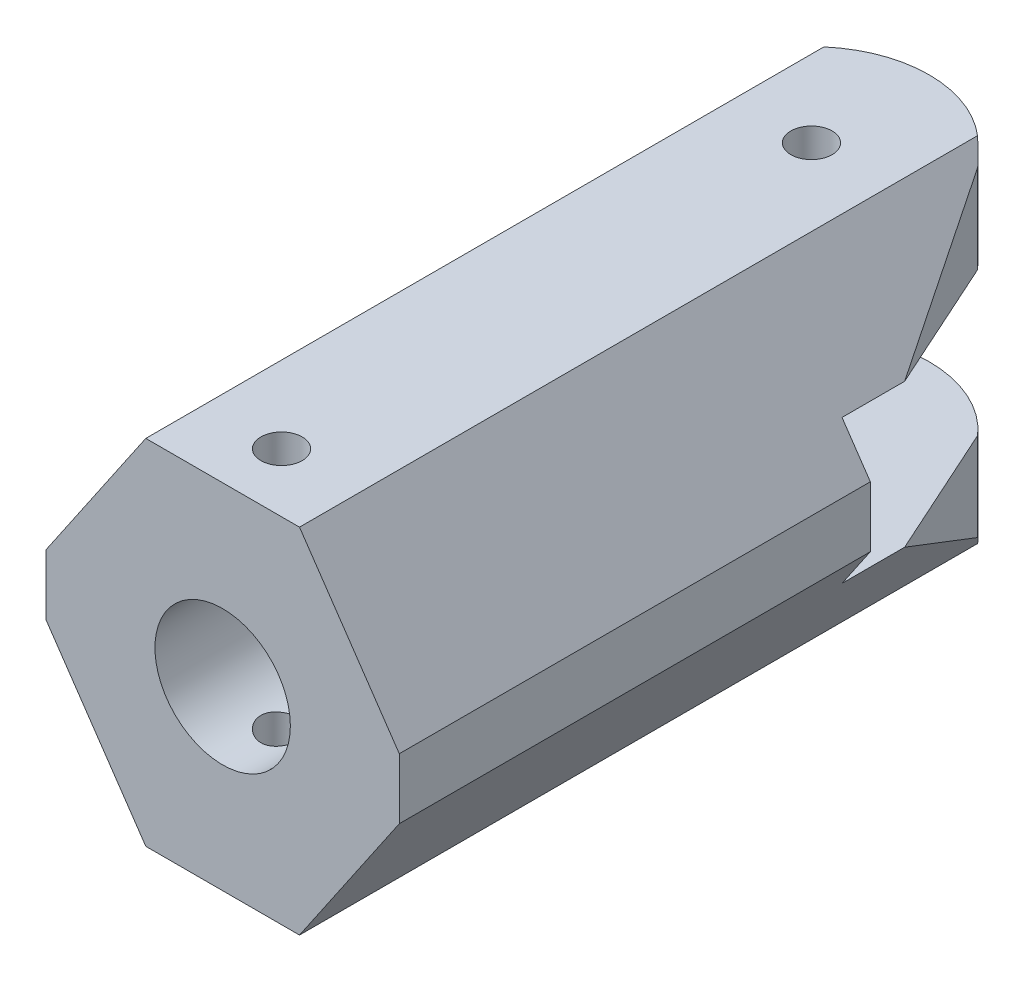
ISO-10303-21;
HEADER;
FILE_DESCRIPTION(('STEP AP214'),'2;1');
FILE_NAME('part.step','',(''),(''),'','','');
FILE_SCHEMA(('AUTOMOTIVE_DESIGN { 1 0 10303 214 1 1 1 1 }'));
ENDSEC;
DATA;
#1=APPLICATION_CONTEXT('core data for automotive mechanical design processes');
#2=APPLICATION_PROTOCOL_DEFINITION('international standard','automotive_design',2000,#1);
#3=PRODUCT_CONTEXT('',#1,'mechanical');
#4=PRODUCT('Part','Part','',(#3));
#5=PRODUCT_RELATED_PRODUCT_CATEGORY('part','',(#4));
#6=PRODUCT_DEFINITION_FORMATION('','',#4);
#7=PRODUCT_DEFINITION_CONTEXT('part definition',#1,'design');
#8=PRODUCT_DEFINITION('design','',#6,#7);
#9=PRODUCT_DEFINITION_SHAPE('','',#8);
#10=(LENGTH_UNIT() NAMED_UNIT(*) SI_UNIT(.MILLI.,.METRE.));
#11=(NAMED_UNIT(*) PLANE_ANGLE_UNIT() SI_UNIT($,.RADIAN.));
#12=(NAMED_UNIT(*) SI_UNIT($,.STERADIAN.) SOLID_ANGLE_UNIT());
#13=UNCERTAINTY_MEASURE_WITH_UNIT(LENGTH_MEASURE(1.E-05),#10,'distance_accuracy_value','');
#14=(GEOMETRIC_REPRESENTATION_CONTEXT(3) GLOBAL_UNCERTAINTY_ASSIGNED_CONTEXT((#13)) GLOBAL_UNIT_ASSIGNED_CONTEXT((#10,
#11,#12)) REPRESENTATION_CONTEXT('',''));
#15=CARTESIAN_POINT('',(0.,0.,0.));
#16=DIRECTION('',(0.,0.,1.));
#17=DIRECTION('',(1.,0.,0.));
#18=AXIS2_PLACEMENT_3D('',#15,#16,#17);
#19=CARTESIAN_POINT('',(24.9073490583335,30.,-11.2625234577486));
#20=DIRECTION('',(-0.911177791987446,0.,0.412013387390366));
#21=DIRECTION('',(0.412013387390366,0.,0.911177791987446));
#22=AXIS2_PLACEMENT_3D('',#19,#20,#21);
#23=PLANE('',#22);
#24=DIRECTION('',(0.412013387390366,0.,0.911177791987446));
#25=VECTOR('',#24,1.);
#26=CARTESIAN_POINT('',(24.9073490583335,21.1,-11.2625234577486));
#27=LINE('',#26,#25);
#28=CARTESIAN_POINT('',(22.4741765584102,21.1,-16.6435445940937));
#29=VERTEX_POINT('',#28);
#30=CARTESIAN_POINT('',(27.5950837724059,21.1,-5.31853169153904));
#31=VERTEX_POINT('',#30);
#32=EDGE_CURVE('E183',#29,#31,#27,.T.);
#33=ORIENTED_EDGE('',*,*,#32,.F.);
#34=DIRECTION('',(0.,-1.,0.));
#35=VECTOR('',#34,1.);
#36=CARTESIAN_POINT('',(22.4741765584102,30.,-16.6435445940937));
#37=LINE('',#36,#35);
#38=CARTESIAN_POINT('',(22.4741765584102,28.6102629224508,-16.6435445940937));
#39=VERTEX_POINT('',#38);
#40=EDGE_CURVE('E239',#39,#29,#37,.T.);
#41=ORIENTED_EDGE('',*,*,#40,.F.);
#42=DIRECTION('',(0.352635024078461,-0.517170422314209,0.779861073574342));
#43=VECTOR('',#42,1.);
#44=CARTESIAN_POINT('',(24.0031102855576,26.3679465120895,-13.2622698582866));
#45=LINE('',#44,#43);
#46=EDGE_CURVE('E211',#39,#31,#45,.T.);
#47=ORIENTED_EDGE('',*,*,#46,.T.);
#48=EDGE_LOOP('',(#33,#41,#47));
#49=FACE_BOUND('',#48,.T.);
#50=ADVANCED_FACE('F41',(#49),#23,.F.);
#51=CARTESIAN_POINT('',(15.,30.,-10.));
#52=DIRECTION('',(0.,-1.,0.));
#53=DIRECTION('',(0.,0.,-1.));
#54=AXIS2_PLACEMENT_3D('',#51,#52,#53);
#55=CYLINDRICAL_SURFACE('',#54,10.);
#56=CARTESIAN_POINT('',(15.,21.1,-10.));
#57=DIRECTION('',(0.,-1.,0.));
#58=DIRECTION('',(0.,0.,-1.));
#59=AXIS2_PLACEMENT_3D('',#56,#57,#58);
#60=CIRCLE('',#59,10.);
#61=CARTESIAN_POINT('',(5.76923076923077,21.1,-13.8461538461538));
#62=VERTEX_POINT('',#61);
#63=EDGE_CURVE('E187',#62,#29,#60,.T.);
#64=ORIENTED_EDGE('',*,*,#63,.F.);
#65=DIRECTION('',(0.,-1.,0.));
#66=VECTOR('',#65,1.);
#67=CARTESIAN_POINT('',(5.76923076923077,30.,-13.8461538461538));
#68=LINE('',#67,#66);
#69=CARTESIAN_POINT('',(5.76923076923077,26.0340645525582,-13.8461538461538));
#70=VERTEX_POINT('',#69);
#71=EDGE_CURVE('E235',#70,#62,#68,.T.);
#72=ORIENTED_EDGE('',*,*,#71,.F.);
#73=CARTESIAN_POINT('',(15.,39.5718032778521,-10.));
#74=DIRECTION('',(0.826213343184909,-0.563357356873252,0.));
#75=DIRECTION('',(-0.563357356873252,-0.826213343184909,0.));
#76=AXIS2_PLACEMENT_3D('',#73,#74,#75);
#77=ELLIPSE('',#76,17.7507223044038,10.);
#78=CARTESIAN_POINT('',(8.47342204092839,30.,-17.5765282381946));
#79=VERTEX_POINT('',#78);
#80=EDGE_CURVE('E214',#70,#79,#77,.T.);
#81=ORIENTED_EDGE('',*,*,#80,.T.);
#82=CARTESIAN_POINT('',(15.,30.,-10.));
#83=DIRECTION('',(0.,1.,0.));
#84=DIRECTION('',(0.,0.,1.));
#85=AXIS2_PLACEMENT_3D('',#82,#83,#84);
#86=CIRCLE('',#85,10.);
#87=CARTESIAN_POINT('',(21.5265779590716,30.,-17.5765282381946));
#88=VERTEX_POINT('',#87);
#89=EDGE_CURVE('E226',#88,#79,#86,.T.);
#90=ORIENTED_EDGE('',*,*,#89,.F.);
#91=CARTESIAN_POINT('',(15.,39.5718032778521,-10.));
#92=DIRECTION('',(-0.826213343184909,-0.563357356873252,0.));
#93=DIRECTION('',(0.563357356873252,-0.826213343184909,0.));
#94=AXIS2_PLACEMENT_3D('',#91,#92,#93);
#95=ELLIPSE('',#94,17.7507223044038,10.);
#96=EDGE_CURVE('E208',#88,#39,#95,.T.);
#97=ORIENTED_EDGE('',*,*,#96,.T.);
#98=ORIENTED_EDGE('',*,*,#40,.T.);
#99=EDGE_LOOP('',(#64,#72,#81,#90,#97,#98));
#100=FACE_BOUND('',#99,.T.);
#101=ADVANCED_FACE('F343',(#100),#55,.T.);
#102=CARTESIAN_POINT('',(0.,30.,0.));
#103=DIRECTION('',(-0.923076923076923,0.,-0.384615384615385));
#104=DIRECTION('',(-0.384615384615385,0.,0.923076923076923));
#105=AXIS2_PLACEMENT_3D('',#102,#103,#104);
#106=PLANE('',#105);
#107=ORIENTED_EDGE('',*,*,#71,.T.);
#108=DIRECTION('',(-0.384615384615385,0.,0.923076923076923));
#109=VECTOR('',#108,1.);
#110=CARTESIAN_POINT('',(0.,21.1,0.));
#111=LINE('',#110,#109);
#112=CARTESIAN_POINT('',(2.40491622759415,21.1,-5.77179894622595));
#113=VERTEX_POINT('',#112);
#114=EDGE_CURVE('E304',#62,#113,#111,.T.);
#115=ORIENTED_EDGE('',*,*,#114,.T.);
#116=DIRECTION('',(-0.334996035725985,-0.491301287280658,0.803990485742364));
#117=VECTOR('',#116,1.);
#118=CARTESIAN_POINT('',(2.04528880968314,20.5725746142691,-4.90869314323954));
#119=LINE('',#118,#117);
#120=EDGE_CURVE('E182',#70,#113,#119,.T.);
#121=ORIENTED_EDGE('',*,*,#120,.F.);
#122=EDGE_LOOP('',(#107,#115,#121));
#123=FACE_BOUND('',#122,.T.);
#124=ADVANCED_FACE('F338',(#123),#106,.T.);
#125=CARTESIAN_POINT('',(15.,30.,-10.));
#126=DIRECTION('',(0.,-1.,0.));
#127=DIRECTION('',(0.,0.,-1.));
#128=AXIS2_PLACEMENT_3D('',#125,#126,#127);
#129=CYLINDRICAL_SURFACE('',#128,1.75);
#130=CARTESIAN_POINT('',(15.,30.,-10.));
#131=DIRECTION('',(0.,1.,0.));
#132=DIRECTION('',(0.,0.,1.));
#133=AXIS2_PLACEMENT_3D('',#130,#131,#132);
#134=CIRCLE('',#133,1.75);
#135=CARTESIAN_POINT('',(15.,30.,-8.25));
#136=VERTEX_POINT('',#135);
#137=EDGE_CURVE('E223',#136,#136,#134,.T.);
#138=ORIENTED_EDGE('',*,*,#137,.T.);
#139=EDGE_LOOP('',(#138));
#140=FACE_BOUND('',#139,.T.);
#141=CARTESIAN_POINT('',(15.,21.1,-10.));
#142=DIRECTION('',(0.,-1.,0.));
#143=DIRECTION('',(0.,0.,-1.));
#144=AXIS2_PLACEMENT_3D('',#141,#142,#143);
#145=CIRCLE('',#144,1.75);
#146=CARTESIAN_POINT('',(15.,21.1,-11.75));
#147=VERTEX_POINT('',#146);
#148=EDGE_CURVE('E301',#147,#147,#145,.T.);
#149=ORIENTED_EDGE('',*,*,#148,.T.);
#150=EDGE_LOOP('',(#149));
#151=FACE_BOUND('',#150,.T.);
#152=ADVANCED_FACE('F351',(#140,#151),#129,.F.);
#153=CARTESIAN_POINT('',(0.,0.,40.));
#154=DIRECTION('',(0.,0.,-1.));
#155=DIRECTION('',(-1.,0.,0.));
#156=AXIS2_PLACEMENT_3D('',#153,#154,#155);
#157=PLANE('',#156);
#158=CARTESIAN_POINT('',(15.,15.,40.));
#159=DIRECTION('',(0.,0.,1.));
#160=DIRECTION('',(1.,0.,0.));
#161=AXIS2_PLACEMENT_3D('',#158,#159,#160);
#162=CIRCLE('',#161,5.75000000000001);
#163=CARTESIAN_POINT('',(20.75,15.,40.));
#164=VERTEX_POINT('',#163);
#165=EDGE_CURVE('E275',#164,#164,#162,.T.);
#166=ORIENTED_EDGE('',*,*,#165,.F.);
#167=EDGE_LOOP('',(#166));
#168=FACE_BOUND('',#167,.T.);
#169=DIRECTION('',(-0.563357356873252,-0.826213343184909,0.));
#170=VECTOR('',#169,1.);
#171=CARTESIAN_POINT('',(30.,12.4270221507505,40.));
#172=LINE('',#171,#170);
#173=CARTESIAN_POINT('',(30.,12.4270221507505,40.));
#174=VERTEX_POINT('',#173);
#175=CARTESIAN_POINT('',(21.5265779590716,0.,40.));
#176=VERTEX_POINT('',#175);
#177=EDGE_CURVE('E242',#174,#176,#172,.T.);
#178=ORIENTED_EDGE('',*,*,#177,.F.);
#179=DIRECTION('',(0.,1.,0.));
#180=VECTOR('',#179,1.);
#181=CARTESIAN_POINT('',(30.,0.,40.));
#182=LINE('',#181,#180);
#183=CARTESIAN_POINT('',(30.,17.5729778492495,40.));
#184=VERTEX_POINT('',#183);
#185=EDGE_CURVE('E290',#174,#184,#182,.T.);
#186=ORIENTED_EDGE('',*,*,#185,.T.);
#187=DIRECTION('',(-0.563357356873252,0.826213343184909,0.));
#188=VECTOR('',#187,1.);
#189=CARTESIAN_POINT('',(30.,17.5729778492495,40.));
#190=LINE('',#189,#188);
#191=CARTESIAN_POINT('',(21.5265779590716,30.,40.));
#192=VERTEX_POINT('',#191);
#193=EDGE_CURVE('E263',#184,#192,#190,.T.);
#194=ORIENTED_EDGE('',*,*,#193,.T.);
#195=DIRECTION('',(-1.,0.,0.));
#196=VECTOR('',#195,1.);
#197=CARTESIAN_POINT('',(0.,30.,40.));
#198=LINE('',#197,#196);
#199=CARTESIAN_POINT('',(8.47342204092839,30.,40.));
#200=VERTEX_POINT('',#199);
#201=EDGE_CURVE('E292',#192,#200,#198,.T.);
#202=ORIENTED_EDGE('',*,*,#201,.T.);
#203=DIRECTION('',(0.563357356873252,0.826213343184909,0.));
#204=VECTOR('',#203,1.);
#205=CARTESIAN_POINT('',(0.,17.5729778492495,40.));
#206=LINE('',#205,#204);
#207=CARTESIAN_POINT('',(0.,17.5729778492495,40.));
#208=VERTEX_POINT('',#207);
#209=EDGE_CURVE('E256',#208,#200,#206,.T.);
#210=ORIENTED_EDGE('',*,*,#209,.F.);
#211=DIRECTION('',(0.,-1.,0.));
#212=VECTOR('',#211,1.);
#213=CARTESIAN_POINT('',(0.,0.,40.));
#214=LINE('',#213,#212);
#215=CARTESIAN_POINT('',(0.,12.4270221507505,40.));
#216=VERTEX_POINT('',#215);
#217=EDGE_CURVE('E283',#208,#216,#214,.T.);
#218=ORIENTED_EDGE('',*,*,#217,.T.);
#219=DIRECTION('',(0.563357356873252,-0.826213343184909,0.));
#220=VECTOR('',#219,1.);
#221=CARTESIAN_POINT('',(0.,12.4270221507505,40.));
#222=LINE('',#221,#220);
#223=CARTESIAN_POINT('',(8.47342204092839,0.,40.));
#224=VERTEX_POINT('',#223);
#225=EDGE_CURVE('E248',#216,#224,#222,.T.);
#226=ORIENTED_EDGE('',*,*,#225,.T.);
#227=DIRECTION('',(1.,0.,0.));
#228=VECTOR('',#227,1.);
#229=CARTESIAN_POINT('',(0.,0.,40.));
#230=LINE('',#229,#228);
#231=EDGE_CURVE('E286',#224,#176,#230,.T.);
#232=ORIENTED_EDGE('',*,*,#231,.T.);
#233=EDGE_LOOP('',(#178,#186,#194,#202,#210,#218,#226,#232));
#234=FACE_BOUND('',#233,.T.);
#235=ADVANCED_FACE('F414',(#168,#234),#157,.F.);
#236=CARTESIAN_POINT('',(30.,0.,40.));
#237=DIRECTION('',(-1.,0.,0.));
#238=DIRECTION('',(0.,0.,1.));
#239=AXIS2_PLACEMENT_3D('',#236,#237,#238);
#240=PLANE('',#239);
#241=DIRECTION('',(0.,0.,1.));
#242=VECTOR('',#241,1.);
#243=CARTESIAN_POINT('',(30.,12.4270221507505,-72.8868986855663));
#244=LINE('',#243,#242);
#245=CARTESIAN_POINT('',(30.,12.4270221507505,0.));
#246=VERTEX_POINT('',#245);
#247=EDGE_CURVE('E245',#246,#174,#244,.T.);
#248=ORIENTED_EDGE('',*,*,#247,.F.);
#249=DIRECTION('',(0.,1.,0.));
#250=VECTOR('',#249,1.);
#251=CARTESIAN_POINT('',(30.,0.,0.));
#252=LINE('',#251,#250);
#253=CARTESIAN_POINT('',(30.,17.5729778492495,0.));
#254=VERTEX_POINT('',#253);
#255=EDGE_CURVE('E287',#246,#254,#252,.T.);
#256=ORIENTED_EDGE('',*,*,#255,.T.);
#257=DIRECTION('',(0.,0.,1.));
#258=VECTOR('',#257,1.);
#259=CARTESIAN_POINT('',(30.,17.5729778492495,-72.8868986855663));
#260=LINE('',#259,#258);
#261=EDGE_CURVE('E268',#254,#184,#260,.T.);
#262=ORIENTED_EDGE('',*,*,#261,.T.);
#263=ORIENTED_EDGE('',*,*,#185,.F.);
#264=EDGE_LOOP('',(#248,#256,#262,#263));
#265=FACE_BOUND('',#264,.T.);
#266=ADVANCED_FACE('F394',(#265),#240,.F.);
#267=CARTESIAN_POINT('',(0.,0.,40.));
#268=DIRECTION('',(0.,1.,0.));
#269=DIRECTION('',(0.,0.,1.));
#270=AXIS2_PLACEMENT_3D('',#267,#268,#269);
#271=PLANE('',#270);
#272=CARTESIAN_POINT('',(15.,0.,35.));
#273=DIRECTION('',(0.,-1.,0.));
#274=DIRECTION('',(0.,0.,-1.));
#275=AXIS2_PLACEMENT_3D('',#272,#273,#274);
#276=CIRCLE('',#275,3.58);
#277=CARTESIAN_POINT('',(15.,0.,31.42));
#278=VERTEX_POINT('',#277);
#279=EDGE_CURVE('E271',#278,#278,#276,.T.);
#280=ORIENTED_EDGE('',*,*,#279,.F.);
#281=EDGE_LOOP('',(#280));
#282=FACE_BOUND('',#281,.T.);
#283=CARTESIAN_POINT('',(15.,0.,-10.));
#284=DIRECTION('',(0.,1.,0.));
#285=DIRECTION('',(0.,0.,1.));
#286=AXIS2_PLACEMENT_3D('',#283,#284,#285);
#287=CIRCLE('',#286,10.);
#288=CARTESIAN_POINT('',(21.5265779590716,0.,-17.5765282381946));
#289=VERTEX_POINT('',#288);
#290=CARTESIAN_POINT('',(8.47342204092839,0.,-17.5765282381946));
#291=VERTEX_POINT('',#290);
#292=EDGE_CURVE('E227',#289,#291,#287,.T.);
#293=ORIENTED_EDGE('',*,*,#292,.F.);
#294=DIRECTION('',(0.,0.,1.));
#295=VECTOR('',#294,1.);
#296=CARTESIAN_POINT('',(21.5265779590716,0.,-72.8868986855663));
#297=LINE('',#296,#295);
#298=EDGE_CURVE('E71',#289,#176,#297,.T.);
#299=ORIENTED_EDGE('',*,*,#298,.T.);
#300=ORIENTED_EDGE('',*,*,#231,.F.);
#301=DIRECTION('',(0.,0.,1.));
#302=VECTOR('',#301,1.);
#303=CARTESIAN_POINT('',(8.47342204092839,0.,-122.886898685566));
#304=LINE('',#303,#302);
#305=EDGE_CURVE('E251',#291,#224,#304,.T.);
#306=ORIENTED_EDGE('',*,*,#305,.F.);
#307=EDGE_LOOP('',(#293,#299,#300,#306));
#308=FACE_BOUND('',#307,.T.);
#309=CARTESIAN_POINT('',(15.,0.,-10.));
#310=DIRECTION('',(0.,1.,0.));
#311=DIRECTION('',(0.,0.,1.));
#312=AXIS2_PLACEMENT_3D('',#309,#310,#311);
#313=CIRCLE('',#312,1.75);
#314=CARTESIAN_POINT('',(15.,0.,-8.25));
#315=VERTEX_POINT('',#314);
#316=EDGE_CURVE('E222',#315,#315,#313,.T.);
#317=ORIENTED_EDGE('',*,*,#316,.T.);
#318=EDGE_LOOP('',(#317));
#319=FACE_BOUND('',#318,.T.);
#320=ADVANCED_FACE('F419',(#282,#308,#319),#271,.F.);
#321=CARTESIAN_POINT('',(0.,0.,40.));
#322=DIRECTION('',(1.,0.,0.));
#323=DIRECTION('',(0.,0.,-1.));
#324=AXIS2_PLACEMENT_3D('',#321,#322,#323);
#325=PLANE('',#324);
#326=DIRECTION('',(0.,-1.,0.));
#327=VECTOR('',#326,1.);
#328=CARTESIAN_POINT('',(0.,0.,0.));
#329=LINE('',#328,#327);
#330=CARTESIAN_POINT('',(0.,17.5729778492495,0.));
#331=VERTEX_POINT('',#330);
#332=CARTESIAN_POINT('',(0.,12.4270221507505,0.));
#333=VERTEX_POINT('',#332);
#334=EDGE_CURVE('E168',#331,#333,#329,.T.);
#335=ORIENTED_EDGE('',*,*,#334,.T.);
#336=DIRECTION('',(0.,0.,1.));
#337=VECTOR('',#336,1.);
#338=CARTESIAN_POINT('',(0.,12.4270221507505,-122.886898685566));
#339=LINE('',#338,#337);
#340=EDGE_CURVE('E254',#333,#216,#339,.T.);
#341=ORIENTED_EDGE('',*,*,#340,.T.);
#342=ORIENTED_EDGE('',*,*,#217,.F.);
#343=DIRECTION('',(0.,0.,1.));
#344=VECTOR('',#343,1.);
#345=CARTESIAN_POINT('',(0.,17.5729778492495,-72.8868986855663));
#346=LINE('',#345,#344);
#347=EDGE_CURVE('E261',#331,#208,#346,.T.);
#348=ORIENTED_EDGE('',*,*,#347,.F.);
#349=EDGE_LOOP('',(#335,#341,#342,#348));
#350=FACE_BOUND('',#349,.T.);
#351=ADVANCED_FACE('F43',(#350),#325,.F.);
#352=CARTESIAN_POINT('',(0.,30.,40.));
#353=DIRECTION('',(0.,-1.,0.));
#354=DIRECTION('',(0.,0.,-1.));
#355=AXIS2_PLACEMENT_3D('',#352,#353,#354);
#356=PLANE('',#355);
#357=CARTESIAN_POINT('',(15.,30.,35.));
#358=DIRECTION('',(0.,-1.,0.));
#359=DIRECTION('',(0.,0.,-1.));
#360=AXIS2_PLACEMENT_3D('',#357,#358,#359);
#361=CIRCLE('',#360,1.75);
#362=CARTESIAN_POINT('',(15.,30.,33.25));
#363=VERTEX_POINT('',#362);
#364=EDGE_CURVE('E311',#363,#363,#361,.T.);
#365=ORIENTED_EDGE('',*,*,#364,.T.);
#366=EDGE_LOOP('',(#365));
#367=FACE_BOUND('',#366,.T.);
#368=DIRECTION('',(0.,0.,1.));
#369=VECTOR('',#368,1.);
#370=CARTESIAN_POINT('',(21.5265779590716,30.,-72.8868986855663));
#371=LINE('',#370,#369);
#372=EDGE_CURVE('E265',#88,#192,#371,.T.);
#373=ORIENTED_EDGE('',*,*,#372,.F.);
#374=ORIENTED_EDGE('',*,*,#89,.T.);
#375=DIRECTION('',(0.,0.,1.));
#376=VECTOR('',#375,1.);
#377=CARTESIAN_POINT('',(8.47342204092839,30.,-72.8868986855663));
#378=LINE('',#377,#376);
#379=EDGE_CURVE('E258',#79,#200,#378,.T.);
#380=ORIENTED_EDGE('',*,*,#379,.T.);
#381=ORIENTED_EDGE('',*,*,#201,.F.);
#382=EDGE_LOOP('',(#373,#374,#380,#381));
#383=FACE_BOUND('',#382,.T.);
#384=ORIENTED_EDGE('',*,*,#137,.F.);
#385=EDGE_LOOP('',(#384));
#386=FACE_BOUND('',#385,.T.);
#387=ADVANCED_FACE('F377',(#367,#383,#386),#356,.F.);
#388=CARTESIAN_POINT('',(15.,15.,30.));
#389=DIRECTION('',(0.,0.,1.));
#390=DIRECTION('',(1.,0.,0.));
#391=AXIS2_PLACEMENT_3D('',#388,#389,#390);
#392=CYLINDRICAL_SURFACE('',#391,5.75000000000001);
#393=CARTESIAN_POINT('',(15.,20.75,33.25));
#394=CARTESIAN_POINT('',(14.9040614286712,20.7499992877784,33.2500009844561));
#395=CARTESIAN_POINT('',(14.808112870937,20.7475760477829,33.257915424512));
#396=CARTESIAN_POINT('',(14.619013939556,20.7381462331717,33.2892862449206));
#397=CARTESIAN_POINT('',(14.5258643382671,20.7311384053924,33.3127468747335));
#398=CARTESIAN_POINT('',(14.3451178938947,20.713306486217,33.3743512410698));
#399=CARTESIAN_POINT('',(14.2575129479825,20.7024881228164,33.4124729469282));
#400=CARTESIAN_POINT('',(14.0899386243222,20.6781570125694,33.5022258205488));
#401=CARTESIAN_POINT('',(14.0099703300441,20.6646438842334,33.5538589013974));
#402=CARTESIAN_POINT('',(13.8575832613366,20.635917020888,33.6707711000204));
#403=CARTESIAN_POINT('',(13.7854211623379,20.6206676713937,33.7363759997399));
#404=CARTESIAN_POINT('',(13.6529347575475,20.5903973810725,33.8786754457603));
#405=CARTESIAN_POINT('',(13.592612515021,20.575376480476,33.9553719208903));
#406=CARTESIAN_POINT('',(13.4841533754655,20.5468851799902,34.1198664583651));
#407=CARTESIAN_POINT('',(13.436332296715,20.5334589341334,34.2078811236319));
#408=CARTESIAN_POINT('',(13.3562755934405,20.5102105585375,34.3911778152082));
#409=CARTESIAN_POINT('',(13.3240361023816,20.5003875348133,34.4864580317863));
#410=CARTESIAN_POINT('',(13.2769879902309,20.4858294183864,34.6786939904436));
#411=CARTESIAN_POINT('',(13.2617051506051,20.4809562457067,34.7755229305507));
#412=CARTESIAN_POINT('',(13.2475231073781,20.4764390945471,34.9704836686312));
#413=CARTESIAN_POINT('',(13.2486198029569,20.4767938072009,35.0686151343543));
#414=CARTESIAN_POINT('',(13.2667937628963,20.4825701412758,35.2595163237647));
#415=CARTESIAN_POINT('',(13.2832739397093,20.4878024363189,35.3523495736248));
#416=CARTESIAN_POINT('',(13.3307811857626,20.5024376577923,35.5338655848944));
#417=CARTESIAN_POINT('',(13.3618097284897,20.5118410066698,35.6225479248907));
#418=CARTESIAN_POINT('',(13.4379664547611,20.5339078399186,35.7946921045002));
#419=CARTESIAN_POINT('',(13.4832861630656,20.5466151710089,35.8780633522652));
#420=CARTESIAN_POINT('',(13.5866056812107,20.5738374364078,36.0362161983899));
#421=CARTESIAN_POINT('',(13.6446086407258,20.5883528193299,36.1109956560725));
#422=CARTESIAN_POINT('',(13.7746013899249,20.6183206488597,36.2532250233202));
#423=CARTESIAN_POINT('',(13.8470857989902,20.6337865352416,36.3202208323392));
#424=CARTESIAN_POINT('',(14.0024534366739,20.6633599407721,36.4412133061259));
#425=CARTESIAN_POINT('',(14.0853373579423,20.6774673693311,36.4952091043399));
#426=CARTESIAN_POINT('',(14.2599936596993,20.7028696552854,36.5889554491028));
#427=CARTESIAN_POINT('',(14.3518247002213,20.7141439376432,36.6286026574874));
#428=CARTESIAN_POINT('',(14.5412746508429,20.7324612780653,36.691754395197));
#429=CARTESIAN_POINT('',(14.6388918887772,20.7395055520814,36.7152635638171));
#430=CARTESIAN_POINT('',(14.8332848533188,20.7483757045189,36.7447098585336));
#431=CARTESIAN_POINT('',(14.9299591969963,20.75038419386,36.7512621816407));
#432=CARTESIAN_POINT('',(15.1230337253814,20.7494937077195,36.7483366169257));
#433=CARTESIAN_POINT('',(15.2194339460313,20.7465954084273,36.7388609378728));
#434=CARTESIAN_POINT('',(15.406884309721,20.7363367036362,36.7046445888913));
#435=CARTESIAN_POINT('',(15.4980068247858,20.729082108045,36.6802656578411));
#436=CARTESIAN_POINT('',(15.6748464123152,20.7109535250774,36.6173721762773));
#437=CARTESIAN_POINT('',(15.760562826945,20.7000790982329,36.5788559093533));
#438=CARTESIAN_POINT('',(15.9264028159371,20.6755154369864,36.4877630480178));
#439=CARTESIAN_POINT('',(16.0063469058554,20.6617658887943,36.4348763959721));
#440=CARTESIAN_POINT('',(16.156434027489,20.6330284271798,36.3169191336232));
#441=CARTESIAN_POINT('',(16.2265745243856,20.6180401950712,36.2518453823613));
#442=CARTESIAN_POINT('',(16.3577873686887,20.5878100736942,36.108469464992));
#443=CARTESIAN_POINT('',(16.4184217280034,20.5725797068276,36.0297631528728));
#444=CARTESIAN_POINT('',(16.525655873481,20.5441827300437,35.8629616228214));
#445=CARTESIAN_POINT('',(16.5722559817109,20.5310160727705,35.7748666204096));
#446=CARTESIAN_POINT('',(16.6497890932586,20.508387238717,35.5920370936012));
#447=CARTESIAN_POINT('',(16.6807911843168,20.4989087690732,35.4973340017023));
#448=CARTESIAN_POINT('',(16.7263091460597,20.484791305617,35.3037074105443));
#449=CARTESIAN_POINT('',(16.7408308778262,20.480150591351,35.204785424689));
#450=CARTESIAN_POINT('',(16.7525696171252,20.476406957138,35.0100888758783));
#451=CARTESIAN_POINT('',(16.7505021437606,20.4770750474784,34.9143613030589));
#452=CARTESIAN_POINT('',(16.7308357580085,20.4833212233645,34.7246866034885));
#453=CARTESIAN_POINT('',(16.7132375019193,20.4888991014328,34.6307394016741));
#454=CARTESIAN_POINT('',(16.6634769665991,20.5041805294775,34.448499581505));
#455=CARTESIAN_POINT('',(16.6315093919208,20.5138288212401,34.3601488203534));
#456=CARTESIAN_POINT('',(16.5540697805349,20.5361524158318,34.1899941737098));
#457=CARTESIAN_POINT('',(16.5085951017148,20.5488283107924,34.1081915730756));
#458=CARTESIAN_POINT('',(16.4034434297155,20.5763698872229,33.9501483910554));
#459=CARTESIAN_POINT('',(16.3432992900311,20.5912996888127,33.8742298061348));
#460=CARTESIAN_POINT('',(16.2113503119452,20.6213612535034,33.7333309756807));
#461=CARTESIAN_POINT('',(16.1395424167589,20.6364930685903,33.6683536066887));
#462=CARTESIAN_POINT('',(15.983676589876,20.6658051979512,33.5492104976488));
#463=CARTESIAN_POINT('',(15.8993126746289,20.6799426155729,33.4954333765573));
#464=CARTESIAN_POINT('',(15.7223108279757,20.7051501481167,33.402899777409));
#465=CARTESIAN_POINT('',(15.6296765793055,20.7162216193686,33.3641366543436));
#466=CARTESIAN_POINT('',(15.4482758542031,20.733149892346,33.3059809235281));
#467=CARTESIAN_POINT('',(15.3600398020265,20.7394155635876,33.2850461840496));
#468=CARTESIAN_POINT('',(15.1812051855971,20.7478405868404,33.2570564975598));
#469=CARTESIAN_POINT('',(15.0906070464544,20.7500006726419,33.2499990702524));
#470=CARTESIAN_POINT('',(15.,20.75,33.25));
#471=B_SPLINE_CURVE_WITH_KNOTS('',3,(#393,#394,#395,#396,#397,#398,#399,#400,#401,#402,#403,
#404,#405,#406,#407,#408,#409,#410,#411,#412,#413,#414,#415,#416,#417,#418,#419,#420,#421,#422,
#423,#424,#425,#426,#427,#428,#429,#430,#431,#432,#433,#434,#435,#436,#437,#438,#439,#440,#441,
#442,#443,#444,#445,#446,#447,#448,#449,#450,#451,#452,#453,#454,#455,#456,#457,#458,#459,#460,
#461,#462,#463,#464,#465,#466,#467,#468,#469,#470),.UNSPECIFIED.,.T.,.F.,(4,2,2,2,2,2,2,2,2,2,2,
2,2,2,2,2,2,2,2,2,2,2,2,2,2,2,2,2,2,2,2,2,2,2,2,2,2,2,4),(0.,0.287482817599107,0.57504424937885,
0.862175250836246,1.14934692942177,1.4441397493882,1.73898389572085,2.04068122222845,
2.34230364475786,2.63525967032531,2.9281423519437,3.21010987256565,3.49210595757809,
3.77805449327281,4.06407412034249,4.36240636351857,4.66075848739852,4.96121847505483,
5.26159205153437,5.55090461998092,5.84017732240669,6.12269302127623,6.40524303166014,
6.69445397412982,6.98373955723921,7.28385916157821,7.58397187805467,7.88274334860929,
8.18140853062104,8.46726334993701,8.75310609020812,9.03518724951481,9.31732362284107,
9.61000113895148,9.9027554828015,10.2044074952202,10.505925847241,10.7774811295992,
11.0489878723855),.UNSPECIFIED.);
#472=CARTESIAN_POINT('',(15.,20.75,33.25));
#473=VERTEX_POINT('',#472);
#474=EDGE_CURVE('E45',#473,#473,#471,.T.);
#475=ORIENTED_EDGE('',*,*,#474,.T.);
#476=EDGE_LOOP('',(#475));
#477=FACE_BOUND('',#476,.T.);
#478=CARTESIAN_POINT('',(15.,9.24999999999999,33.25));
#479=CARTESIAN_POINT('',(15.0959385713288,9.25000071222164,33.2500009844561));
#480=CARTESIAN_POINT('',(15.191887129063,9.25242395221709,33.257915424512));
#481=CARTESIAN_POINT('',(15.380986060444,9.26185376682828,33.2892862449206));
#482=CARTESIAN_POINT('',(15.4741356617329,9.26886159460763,33.3127468747335));
#483=CARTESIAN_POINT('',(15.6548821061054,9.28669351378301,33.3743512410698));
#484=CARTESIAN_POINT('',(15.7424870520175,9.29751187718355,33.4124729469282));
#485=CARTESIAN_POINT('',(15.9100613756778,9.32184298743062,33.5022258205488));
#486=CARTESIAN_POINT('',(15.9900296699559,9.33535611576656,33.5538589013974));
#487=CARTESIAN_POINT('',(16.1424167386634,9.36408297911198,33.6707711000204));
#488=CARTESIAN_POINT('',(16.2145788376621,9.37933232860627,33.7363759997399));
#489=CARTESIAN_POINT('',(16.3470652424525,9.40960261892753,33.8786754457603));
#490=CARTESIAN_POINT('',(16.407387484979,9.424623519524,33.9553719208903));
#491=CARTESIAN_POINT('',(16.5158466245345,9.4531148200098,34.1198664583651));
#492=CARTESIAN_POINT('',(16.563667703285,9.46654106586663,34.2078811236319));
#493=CARTESIAN_POINT('',(16.6437244065595,9.48978944146245,34.3911778152081));
#494=CARTESIAN_POINT('',(16.6759638976184,9.49961246518667,34.4864580317863));
#495=CARTESIAN_POINT('',(16.7230120097691,9.51417058161364,34.6786939904436));
#496=CARTESIAN_POINT('',(16.7382948493949,9.51904375429334,34.7755229305507));
#497=CARTESIAN_POINT('',(16.7524768926219,9.52356090545295,34.9704836686312));
#498=CARTESIAN_POINT('',(16.7513801970431,9.52320619279915,35.0686151343543));
#499=CARTESIAN_POINT('',(16.7332062371037,9.51742985872424,35.2595163237647));
#500=CARTESIAN_POINT('',(16.7167260602907,9.51219756368113,35.3523495736248));
#501=CARTESIAN_POINT('',(16.6692188142374,9.49756234220773,35.5338655848944));
#502=CARTESIAN_POINT('',(16.6381902715103,9.48815899333018,35.6225479248907));
#503=CARTESIAN_POINT('',(16.5620335452389,9.46609216008143,35.7946921045002));
#504=CARTESIAN_POINT('',(16.5167138369344,9.45338482899112,35.8780633522651));
#505=CARTESIAN_POINT('',(16.4133943187893,9.42616256359224,36.0362161983899));
#506=CARTESIAN_POINT('',(16.3553913592742,9.41164718067005,36.1109956560725));
#507=CARTESIAN_POINT('',(16.2253986100751,9.38167935114031,36.2532250233202));
#508=CARTESIAN_POINT('',(16.1529142010098,9.3662134647584,36.3202208323392));
#509=CARTESIAN_POINT('',(15.9975465633261,9.33664005922792,36.4412133061259));
#510=CARTESIAN_POINT('',(15.9146626420577,9.3225326306689,36.4952091043399));
#511=CARTESIAN_POINT('',(15.7400063403007,9.29713034471463,36.5889554491028));
#512=CARTESIAN_POINT('',(15.6481752997787,9.28585606235679,36.6286026574874));
#513=CARTESIAN_POINT('',(15.4587253491571,9.26753872193469,36.691754395197));
#514=CARTESIAN_POINT('',(15.3611081112229,9.26049444791855,36.7152635638171));
#515=CARTESIAN_POINT('',(15.1667151466812,9.25162429548107,36.7447098585336));
#516=CARTESIAN_POINT('',(15.0700408030037,9.24961580614003,36.7512621816407));
#517=CARTESIAN_POINT('',(14.8769662746186,9.25050629228048,36.7483366169257));
#518=CARTESIAN_POINT('',(14.7805660539687,9.25340459157267,36.7388609378728));
#519=CARTESIAN_POINT('',(14.593115690279,9.26366329636381,36.7046445888913));
#520=CARTESIAN_POINT('',(14.5019931752142,9.27091789195496,36.6802656578411));
#521=CARTESIAN_POINT('',(14.3251535876848,9.28904647492264,36.6173721762773));
#522=CARTESIAN_POINT('',(14.239437173055,9.29992090176707,36.5788559093533));
#523=CARTESIAN_POINT('',(14.0735971840629,9.32448456301362,36.4877630480178));
#524=CARTESIAN_POINT('',(13.9936530941446,9.33823411120568,36.4348763959721));
#525=CARTESIAN_POINT('',(13.843565972511,9.36697157282019,36.3169191336232));
#526=CARTESIAN_POINT('',(13.7734254756144,9.38195980492875,36.2518453823613));
#527=CARTESIAN_POINT('',(13.6422126313113,9.41218992630579,36.108469464992));
#528=CARTESIAN_POINT('',(13.5815782719966,9.42742029317242,36.0297631528728));
#529=CARTESIAN_POINT('',(13.474344126519,9.45581726995627,35.8629616228214));
#530=CARTESIAN_POINT('',(13.4277440182891,9.46898392722951,35.7748666204096));
#531=CARTESIAN_POINT('',(13.3502109067414,9.49161276128294,35.5920370936012));
#532=CARTESIAN_POINT('',(13.3192088156832,9.50109123092676,35.4973340017023));
#533=CARTESIAN_POINT('',(13.2736908539404,9.51520869438301,35.3037074105443));
#534=CARTESIAN_POINT('',(13.2591691221738,9.51984940864896,35.204785424689));
#535=CARTESIAN_POINT('',(13.2474303828748,9.52359304286204,35.0100888758783));
#536=CARTESIAN_POINT('',(13.2494978562394,9.52292495252158,34.9143613030589));
#537=CARTESIAN_POINT('',(13.2691642419915,9.51667877663549,34.7246866034885));
#538=CARTESIAN_POINT('',(13.2867624980807,9.5111008985672,34.630739401674));
#539=CARTESIAN_POINT('',(13.3365230334009,9.49581947052249,34.448499581505));
#540=CARTESIAN_POINT('',(13.3684906080792,9.48617117875988,34.3601488203534));
#541=CARTESIAN_POINT('',(13.4459302194651,9.46384758416822,34.1899941737098));
#542=CARTESIAN_POINT('',(13.4914048982852,9.45117168920756,34.1081915730756));
#543=CARTESIAN_POINT('',(13.5965565702845,9.42363011277711,33.9501483910554));
#544=CARTESIAN_POINT('',(13.6567007099689,9.40870031118726,33.8742298061348));
#545=CARTESIAN_POINT('',(13.7886496880548,9.37863874649659,33.7333309756807));
#546=CARTESIAN_POINT('',(13.8604575832411,9.3635069314097,33.6683536066887));
#547=CARTESIAN_POINT('',(14.016323410124,9.33419480204879,33.5492104976488));
#548=CARTESIAN_POINT('',(14.1006873253711,9.32005738442705,33.4954333765573));
#549=CARTESIAN_POINT('',(14.2776891720243,9.29484985188326,33.402899777409));
#550=CARTESIAN_POINT('',(14.3703234206945,9.28377838063138,33.3641366543436));
#551=CARTESIAN_POINT('',(14.5517241457969,9.26685010765401,33.3059809235281));
#552=CARTESIAN_POINT('',(14.6399601979735,9.26058443641243,33.2850461840496));
#553=CARTESIAN_POINT('',(14.8187948144029,9.2521594131596,33.2570564975598));
#554=CARTESIAN_POINT('',(14.9093929535456,9.24999932735812,33.2499990702524));
#555=CARTESIAN_POINT('',(15.,9.24999999999999,33.25));
#556=B_SPLINE_CURVE_WITH_KNOTS('',3,(#478,#479,#480,#481,#482,#483,#484,#485,#486,#487,#488,
#489,#490,#491,#492,#493,#494,#495,#496,#497,#498,#499,#500,#501,#502,#503,#504,#505,#506,#507,
#508,#509,#510,#511,#512,#513,#514,#515,#516,#517,#518,#519,#520,#521,#522,#523,#524,#525,#526,
#527,#528,#529,#530,#531,#532,#533,#534,#535,#536,#537,#538,#539,#540,#541,#542,#543,#544,#545,
#546,#547,#548,#549,#550,#551,#552,#553,#554,#555),.UNSPECIFIED.,.T.,.F.,(4,2,2,2,2,2,2,2,2,2,2,
2,2,2,2,2,2,2,2,2,2,2,2,2,2,2,2,2,2,2,2,2,2,2,2,2,2,2,4),(0.,0.287482817599107,0.57504424937885,
0.86217525083625,1.14934692942178,1.44413974938821,1.73898389572085,2.04068122222845,
2.34230364475785,2.63525967032531,2.92814235194371,3.21010987256565,3.49210595757809,
3.77805449327281,4.06407412034249,4.36240636351857,4.66075848739852,4.96121847505483,
5.26159205153437,5.55090461998092,5.84017732240669,6.12269302127623,6.40524303166014,
6.69445397412982,6.98373955723921,7.28385916157821,7.58397187805467,7.8827433486093,
8.18140853062105,8.46726334993702,8.75310609020812,9.03518724951481,9.31732362284107,
9.61000113895148,9.9027554828015,10.2044074952202,10.505925847241,10.7774811295992,
11.0489878723855),.UNSPECIFIED.);
#557=CARTESIAN_POINT('',(15.,9.24999999999999,33.25));
#558=VERTEX_POINT('',#557);
#559=EDGE_CURVE('E306',#558,#558,#556,.T.);
#560=ORIENTED_EDGE('',*,*,#559,.T.);
#561=EDGE_LOOP('',(#560));
#562=FACE_BOUND('',#561,.T.);
#563=CARTESIAN_POINT('',(15.,15.,30.));
#564=DIRECTION('',(0.,0.,1.));
#565=DIRECTION('',(1.,0.,0.));
#566=AXIS2_PLACEMENT_3D('',#563,#564,#565);
#567=CIRCLE('',#566,5.75000000000001);
#568=CARTESIAN_POINT('',(20.75,15.,30.));
#569=VERTEX_POINT('',#568);
#570=EDGE_CURVE('E278',#569,#569,#567,.T.);
#571=ORIENTED_EDGE('',*,*,#570,.F.);
#572=EDGE_LOOP('',(#571));
#573=FACE_BOUND('',#572,.T.);
#574=ORIENTED_EDGE('',*,*,#165,.T.);
#575=EDGE_LOOP('',(#574));
#576=FACE_BOUND('',#575,.T.);
#577=ADVANCED_FACE('F312',(#477,#562,#573,#576),#392,.F.);
#578=CARTESIAN_POINT('',(0.,0.,30.));
#579=DIRECTION('',(0.,0.,1.));
#580=DIRECTION('',(1.,0.,0.));
#581=AXIS2_PLACEMENT_3D('',#578,#579,#580);
#582=PLANE('',#581);
#583=ORIENTED_EDGE('',*,*,#570,.T.);
#584=EDGE_LOOP('',(#583));
#585=FACE_BOUND('',#584,.T.);
#586=ADVANCED_FACE('F370',(#585),#582,.T.);
#587=CARTESIAN_POINT('',(15.,5.,35.));
#588=DIRECTION('',(0.,-1.,0.));
#589=DIRECTION('',(0.,0.,-1.));
#590=AXIS2_PLACEMENT_3D('',#587,#588,#589);
#591=CYLINDRICAL_SURFACE('',#590,3.58);
#592=CARTESIAN_POINT('',(15.,5.,35.));
#593=DIRECTION('',(0.,-1.,0.));
#594=DIRECTION('',(0.,0.,-1.));
#595=AXIS2_PLACEMENT_3D('',#592,#593,#594);
#596=CIRCLE('',#595,3.58);
#597=CARTESIAN_POINT('',(15.,5.,31.42));
#598=VERTEX_POINT('',#597);
#599=EDGE_CURVE('E272',#598,#598,#596,.T.);
#600=ORIENTED_EDGE('',*,*,#599,.F.);
#601=EDGE_LOOP('',(#600));
#602=FACE_BOUND('',#601,.T.);
#603=ORIENTED_EDGE('',*,*,#279,.T.);
#604=EDGE_LOOP('',(#603));
#605=FACE_BOUND('',#604,.T.);
#606=ADVANCED_FACE('F367',(#602,#605),#591,.F.);
#607=CARTESIAN_POINT('',(0.,5.,0.));
#608=DIRECTION('',(0.,-1.,0.));
#609=DIRECTION('',(0.,0.,-1.));
#610=AXIS2_PLACEMENT_3D('',#607,#608,#609);
#611=PLANE('',#610);
#612=CARTESIAN_POINT('',(15.,5.,35.));
#613=DIRECTION('',(0.,-1.,0.));
#614=DIRECTION('',(0.,0.,-1.));
#615=AXIS2_PLACEMENT_3D('',#612,#613,#614);
#616=CIRCLE('',#615,1.75);
#617=CARTESIAN_POINT('',(15.,5.,33.25));
#618=VERTEX_POINT('',#617);
#619=EDGE_CURVE('E405',#618,#618,#616,.T.);
#620=ORIENTED_EDGE('',*,*,#619,.F.);
#621=EDGE_LOOP('',(#620));
#622=FACE_BOUND('',#621,.T.);
#623=ORIENTED_EDGE('',*,*,#599,.T.);
#624=EDGE_LOOP('',(#623));
#625=FACE_BOUND('',#624,.T.);
#626=ADVANCED_FACE('F363',(#622,#625),#611,.T.);
#627=CARTESIAN_POINT('',(30.,17.5729778492495,-72.8868986855663));
#628=DIRECTION('',(0.826213343184909,0.563357356873252,0.));
#629=DIRECTION('',(-0.563357356873252,0.826213343184909,0.));
#630=AXIS2_PLACEMENT_3D('',#627,#628,#629);
#631=PLANE('',#630);
#632=DIRECTION('',(0.563357356873252,-0.826213343184909,0.));
#633=VECTOR('',#632,1.);
#634=CARTESIAN_POINT('',(30.,17.5729778492495,0.));
#635=LINE('',#634,#633);
#636=CARTESIAN_POINT('',(27.5950837724059,21.1,0.));
#637=VERTEX_POINT('',#636);
#638=EDGE_CURVE('E206',#637,#254,#635,.T.);
#639=ORIENTED_EDGE('',*,*,#638,.F.);
#640=DIRECTION('',(0.,0.,-1.));
#641=VECTOR('',#640,1.);
#642=CARTESIAN_POINT('',(27.5950837724059,21.1,-72.8868986855663));
#643=LINE('',#642,#641);
#644=EDGE_CURVE('E176',#637,#31,#643,.T.);
#645=ORIENTED_EDGE('',*,*,#644,.T.);
#646=ORIENTED_EDGE('',*,*,#46,.F.);
#647=ORIENTED_EDGE('',*,*,#96,.F.);
#648=ORIENTED_EDGE('',*,*,#372,.T.);
#649=ORIENTED_EDGE('',*,*,#193,.F.);
#650=ORIENTED_EDGE('',*,*,#261,.F.);
#651=EDGE_LOOP('',(#639,#645,#646,#647,#648,#649,#650));
#652=FACE_BOUND('',#651,.T.);
#653=ADVANCED_FACE('F360',(#652),#631,.T.);
#654=CARTESIAN_POINT('',(0.,17.5729778492495,-72.8868986855663));
#655=DIRECTION('',(0.826213343184909,-0.563357356873252,0.));
#656=DIRECTION('',(0.563357356873252,0.826213343184909,0.));
#657=AXIS2_PLACEMENT_3D('',#654,#655,#656);
#658=PLANE('',#657);
#659=DIRECTION('',(0.,0.,-1.));
#660=VECTOR('',#659,1.);
#661=CARTESIAN_POINT('',(2.40491622759414,21.1,-72.8868986855663));
#662=LINE('',#661,#660);
#663=CARTESIAN_POINT('',(2.40491622759414,21.1,0.));
#664=VERTEX_POINT('',#663);
#665=EDGE_CURVE('E63',#664,#113,#662,.T.);
#666=ORIENTED_EDGE('',*,*,#665,.F.);
#667=DIRECTION('',(-0.563357356873252,-0.826213343184909,0.));
#668=VECTOR('',#667,1.);
#669=CARTESIAN_POINT('',(0.,17.5729778492495,0.));
#670=LINE('',#669,#668);
#671=EDGE_CURVE('E163',#664,#331,#670,.T.);
#672=ORIENTED_EDGE('',*,*,#671,.T.);
#673=ORIENTED_EDGE('',*,*,#347,.T.);
#674=ORIENTED_EDGE('',*,*,#209,.T.);
#675=ORIENTED_EDGE('',*,*,#379,.F.);
#676=ORIENTED_EDGE('',*,*,#80,.F.);
#677=ORIENTED_EDGE('',*,*,#120,.T.);
#678=EDGE_LOOP('',(#666,#672,#673,#674,#675,#676,#677));
#679=FACE_BOUND('',#678,.T.);
#680=ADVANCED_FACE('F180',(#679),#658,.F.);
#681=CARTESIAN_POINT('',(0.,12.4270221507505,-122.886898685566));
#682=DIRECTION('',(-0.826213343184909,-0.563357356873252,0.));
#683=DIRECTION('',(0.563357356873252,-0.826213343184909,0.));
#684=AXIS2_PLACEMENT_3D('',#681,#682,#683);
#685=PLANE('',#684);
#686=DIRECTION('',(0.,0.,1.));
#687=VECTOR('',#686,1.);
#688=CARTESIAN_POINT('',(2.40491622759414,8.9,-122.886898685566));
#689=LINE('',#688,#687);
#690=CARTESIAN_POINT('',(2.40491622759414,8.9,-5.77179894622594));
#691=VERTEX_POINT('',#690);
#692=CARTESIAN_POINT('',(2.40491622759414,8.9,0.));
#693=VERTEX_POINT('',#692);
#694=EDGE_CURVE('E201',#691,#693,#689,.T.);
#695=ORIENTED_EDGE('',*,*,#694,.F.);
#696=DIRECTION('',(0.334996035725985,-0.491301287280658,-0.803990485742364));
#697=VECTOR('',#696,1.);
#698=CARTESIAN_POINT('',(-2.89223069789968,16.6687340322398,6.94135367495922));
#699=LINE('',#698,#697);
#700=CARTESIAN_POINT('',(5.76923076923077,3.96593544744178,-13.8461538461538));
#701=VERTEX_POINT('',#700);
#702=EDGE_CURVE('E55',#691,#701,#699,.T.);
#703=ORIENTED_EDGE('',*,*,#702,.T.);
#704=CARTESIAN_POINT('',(15.,-9.57180327785212,-10.));
#705=DIRECTION('',(0.826213343184909,0.563357356873252,0.));
#706=DIRECTION('',(0.563357356873252,-0.826213343184909,0.));
#707=AXIS2_PLACEMENT_3D('',#704,#705,#706);
#708=ELLIPSE('',#707,17.7507223044038,10.);
#709=EDGE_CURVE('E217',#291,#701,#708,.T.);
#710=ORIENTED_EDGE('',*,*,#709,.F.);
#711=ORIENTED_EDGE('',*,*,#305,.T.);
#712=ORIENTED_EDGE('',*,*,#225,.F.);
#713=ORIENTED_EDGE('',*,*,#340,.F.);
#714=DIRECTION('',(-0.563357356873252,0.826213343184909,0.));
#715=VECTOR('',#714,1.);
#716=CARTESIAN_POINT('',(0.,12.4270221507505,0.));
#717=LINE('',#716,#715);
#718=EDGE_CURVE('E172',#693,#333,#717,.T.);
#719=ORIENTED_EDGE('',*,*,#718,.F.);
#720=EDGE_LOOP('',(#695,#703,#710,#711,#712,#713,#719));
#721=FACE_BOUND('',#720,.T.);
#722=ADVANCED_FACE('F354',(#721),#685,.T.);
#723=CARTESIAN_POINT('',(30.,12.4270221507505,-72.8868986855663));
#724=DIRECTION('',(-0.826213343184909,0.563357356873252,0.));
#725=DIRECTION('',(-0.563357356873252,-0.826213343184909,0.));
#726=AXIS2_PLACEMENT_3D('',#723,#724,#725);
#727=PLANE('',#726);
#728=DIRECTION('',(-0.352635024078461,-0.517170422314209,-0.779861073574342));
#729=VECTOR('',#728,1.);
#730=CARTESIAN_POINT('',(29.4742824153208,11.6560108594102,-1.16263743528095));
#731=LINE('',#730,#729);
#732=CARTESIAN_POINT('',(27.5950837724059,8.9,-5.31853169153903));
#733=VERTEX_POINT('',#732);
#734=CARTESIAN_POINT('',(22.4741765584102,1.38973707754921,-16.6435445940937));
#735=VERTEX_POINT('',#734);
#736=EDGE_CURVE('E220',#733,#735,#731,.T.);
#737=ORIENTED_EDGE('',*,*,#736,.F.);
#738=DIRECTION('',(0.,0.,1.));
#739=VECTOR('',#738,1.);
#740=CARTESIAN_POINT('',(27.5950837724059,8.9,-72.8868986855663));
#741=LINE('',#740,#739);
#742=CARTESIAN_POINT('',(27.5950837724059,8.9,0.));
#743=VERTEX_POINT('',#742);
#744=EDGE_CURVE('E198',#733,#743,#741,.T.);
#745=ORIENTED_EDGE('',*,*,#744,.T.);
#746=DIRECTION('',(0.563357356873252,0.826213343184909,0.));
#747=VECTOR('',#746,1.);
#748=CARTESIAN_POINT('',(30.,12.4270221507505,0.));
#749=LINE('',#748,#747);
#750=EDGE_CURVE('E171',#743,#246,#749,.T.);
#751=ORIENTED_EDGE('',*,*,#750,.T.);
#752=ORIENTED_EDGE('',*,*,#247,.T.);
#753=ORIENTED_EDGE('',*,*,#177,.T.);
#754=ORIENTED_EDGE('',*,*,#298,.F.);
#755=CARTESIAN_POINT('',(15.,-9.57180327785212,-10.));
#756=DIRECTION('',(-0.826213343184909,0.563357356873252,0.));
#757=DIRECTION('',(-0.563357356873252,-0.826213343184909,0.));
#758=AXIS2_PLACEMENT_3D('',#755,#756,#757);
#759=ELLIPSE('',#758,17.7507223044038,10.);
#760=EDGE_CURVE('E12',#735,#289,#759,.T.);
#761=ORIENTED_EDGE('',*,*,#760,.F.);
#762=EDGE_LOOP('',(#737,#745,#751,#752,#753,#754,#761));
#763=FACE_BOUND('',#762,.T.);
#764=ADVANCED_FACE('F346',(#763),#727,.F.);
#765=CARTESIAN_POINT('',(22.4741765584102,8.9,-16.6435445940937));
#766=VERTEX_POINT('',#765);
#767=EDGE_CURVE('E238',#766,#735,#37,.T.);
#768=ORIENTED_EDGE('',*,*,#767,.F.);
#769=DIRECTION('',(0.412013387390366,0.,0.911177791987446));
#770=VECTOR('',#769,1.);
#771=CARTESIAN_POINT('',(24.9073490583335,8.9,-11.2625234577486));
#772=LINE('',#771,#770);
#773=EDGE_CURVE('E195',#766,#733,#772,.T.);
#774=ORIENTED_EDGE('',*,*,#773,.T.);
#775=ORIENTED_EDGE('',*,*,#736,.T.);
#776=EDGE_LOOP('',(#768,#774,#775));
#777=FACE_BOUND('',#776,.T.);
#778=ADVANCED_FACE('F341',(#777),#23,.F.);
#779=CARTESIAN_POINT('',(15.,8.9,-10.));
#780=DIRECTION('',(0.,-1.,0.));
#781=DIRECTION('',(0.,0.,-1.));
#782=AXIS2_PLACEMENT_3D('',#779,#780,#781);
#783=CIRCLE('',#782,10.);
#784=CARTESIAN_POINT('',(5.76923076923077,8.9,-13.8461538461538));
#785=VERTEX_POINT('',#784);
#786=EDGE_CURVE('E193',#785,#766,#783,.T.);
#787=ORIENTED_EDGE('',*,*,#786,.T.);
#788=ORIENTED_EDGE('',*,*,#767,.T.);
#789=ORIENTED_EDGE('',*,*,#760,.T.);
#790=ORIENTED_EDGE('',*,*,#292,.T.);
#791=ORIENTED_EDGE('',*,*,#709,.T.);
#792=EDGE_CURVE('E230',#785,#701,#68,.T.);
#793=ORIENTED_EDGE('',*,*,#792,.F.);
#794=EDGE_LOOP('',(#787,#788,#789,#790,#791,#793));
#795=FACE_BOUND('',#794,.T.);
#796=ADVANCED_FACE('F336',(#795),#55,.T.);
#797=DIRECTION('',(-0.384615384615385,0.,0.923076923076923));
#798=VECTOR('',#797,1.);
#799=CARTESIAN_POINT('',(0.,8.9,0.));
#800=LINE('',#799,#798);
#801=EDGE_CURVE('E191',#785,#691,#800,.T.);
#802=ORIENTED_EDGE('',*,*,#801,.F.);
#803=ORIENTED_EDGE('',*,*,#792,.T.);
#804=ORIENTED_EDGE('',*,*,#702,.F.);
#805=EDGE_LOOP('',(#802,#803,#804));
#806=FACE_BOUND('',#805,.T.);
#807=ADVANCED_FACE('F333',(#806),#106,.T.);
#808=CARTESIAN_POINT('',(15.,8.9,-10.));
#809=DIRECTION('',(0.,-1.,0.));
#810=DIRECTION('',(0.,0.,-1.));
#811=AXIS2_PLACEMENT_3D('',#808,#809,#810);
#812=CIRCLE('',#811,1.75);
#813=CARTESIAN_POINT('',(15.,8.9,-11.75));
#814=VERTEX_POINT('',#813);
#815=EDGE_CURVE('E185',#814,#814,#812,.T.);
#816=ORIENTED_EDGE('',*,*,#815,.F.);
#817=EDGE_LOOP('',(#816));
#818=FACE_BOUND('',#817,.T.);
#819=ORIENTED_EDGE('',*,*,#316,.F.);
#820=EDGE_LOOP('',(#819));
#821=FACE_BOUND('',#820,.T.);
#822=ADVANCED_FACE('F329',(#818,#821),#129,.F.);
#823=CARTESIAN_POINT('',(-14.5,0.,0.));
#824=DIRECTION('',(0.,0.,1.));
#825=DIRECTION('',(0.,-1.,0.));
#826=AXIS2_PLACEMENT_3D('',#823,#824,#825);
#827=PLANE('',#826);
#828=ORIENTED_EDGE('',*,*,#638,.T.);
#829=ORIENTED_EDGE('',*,*,#255,.F.);
#830=ORIENTED_EDGE('',*,*,#750,.F.);
#831=DIRECTION('',(1.,0.,0.));
#832=VECTOR('',#831,1.);
#833=CARTESIAN_POINT('',(-14.5,8.9,0.));
#834=LINE('',#833,#832);
#835=EDGE_CURVE('E177',#693,#743,#834,.T.);
#836=ORIENTED_EDGE('',*,*,#835,.F.);
#837=ORIENTED_EDGE('',*,*,#718,.T.);
#838=ORIENTED_EDGE('',*,*,#334,.F.);
#839=ORIENTED_EDGE('',*,*,#671,.F.);
#840=DIRECTION('',(1.,0.,0.));
#841=VECTOR('',#840,1.);
#842=CARTESIAN_POINT('',(-14.5,21.1,0.));
#843=LINE('',#842,#841);
#844=EDGE_CURVE('E165',#664,#637,#843,.T.);
#845=ORIENTED_EDGE('',*,*,#844,.T.);
#846=EDGE_LOOP('',(#828,#829,#830,#836,#837,#838,#839,#845));
#847=FACE_BOUND('',#846,.T.);
#848=ADVANCED_FACE('F164',(#847),#827,.F.);
#849=CARTESIAN_POINT('',(-14.5,8.9,0.));
#850=DIRECTION('',(0.,-1.,0.));
#851=DIRECTION('',(0.,0.,-1.));
#852=AXIS2_PLACEMENT_3D('',#849,#850,#851);
#853=PLANE('',#852);
#854=ORIENTED_EDGE('',*,*,#694,.T.);
#855=ORIENTED_EDGE('',*,*,#835,.T.);
#856=ORIENTED_EDGE('',*,*,#744,.F.);
#857=ORIENTED_EDGE('',*,*,#773,.F.);
#858=ORIENTED_EDGE('',*,*,#786,.F.);
#859=ORIENTED_EDGE('',*,*,#801,.T.);
#860=EDGE_LOOP('',(#854,#855,#856,#857,#858,#859));
#861=FACE_BOUND('',#860,.T.);
#862=ORIENTED_EDGE('',*,*,#815,.T.);
#863=EDGE_LOOP('',(#862));
#864=FACE_BOUND('',#863,.T.);
#865=ADVANCED_FACE('F322',(#861,#864),#853,.F.);
#866=CARTESIAN_POINT('',(-14.5,21.1,0.));
#867=DIRECTION('',(0.,-1.,0.));
#868=DIRECTION('',(0.,0.,-1.));
#869=AXIS2_PLACEMENT_3D('',#866,#867,#868);
#870=PLANE('',#869);
#871=ORIENTED_EDGE('',*,*,#148,.F.);
#872=EDGE_LOOP('',(#871));
#873=FACE_BOUND('',#872,.T.);
#874=ORIENTED_EDGE('',*,*,#844,.F.);
#875=ORIENTED_EDGE('',*,*,#665,.T.);
#876=ORIENTED_EDGE('',*,*,#114,.F.);
#877=ORIENTED_EDGE('',*,*,#63,.T.);
#878=ORIENTED_EDGE('',*,*,#32,.T.);
#879=ORIENTED_EDGE('',*,*,#644,.F.);
#880=EDGE_LOOP('',(#874,#875,#876,#877,#878,#879));
#881=FACE_BOUND('',#880,.T.);
#882=ADVANCED_FACE('F174',(#873,#881),#870,.T.);
#883=CARTESIAN_POINT('',(15.,30.,35.));
#884=DIRECTION('',(0.,-1.,0.));
#885=DIRECTION('',(0.,0.,-1.));
#886=AXIS2_PLACEMENT_3D('',#883,#884,#885);
#887=CYLINDRICAL_SURFACE('',#886,1.75);
#888=ORIENTED_EDGE('',*,*,#619,.T.);
#889=EDGE_LOOP('',(#888));
#890=FACE_BOUND('',#889,.T.);
#891=ORIENTED_EDGE('',*,*,#559,.F.);
#892=EDGE_LOOP('',(#891));
#893=FACE_BOUND('',#892,.T.);
#894=ADVANCED_FACE('F320',(#890,#893),#887,.F.);
#895=ORIENTED_EDGE('',*,*,#364,.F.);
#896=EDGE_LOOP('',(#895));
#897=FACE_BOUND('',#896,.T.);
#898=ORIENTED_EDGE('',*,*,#474,.F.);
#899=EDGE_LOOP('',(#898));
#900=FACE_BOUND('',#899,.T.);
#901=ADVANCED_FACE('F316',(#897,#900),#887,.F.);
#902=CLOSED_SHELL('',(#50,#101,#124,#152,#235,#266,#320,#351,#387,#577,#586,#606,#626,#653,#680,
#722,#764,#778,#796,#807,#822,#848,#865,#882,#894,#901));
#903=MANIFOLD_SOLID_BREP('B2',#902);
#904=ADVANCED_BREP_SHAPE_REPRESENTATION('',(#18,#903),#14);
#905=SHAPE_DEFINITION_REPRESENTATION(#9,#904);
ENDSEC;
END-ISO-10303-21;
